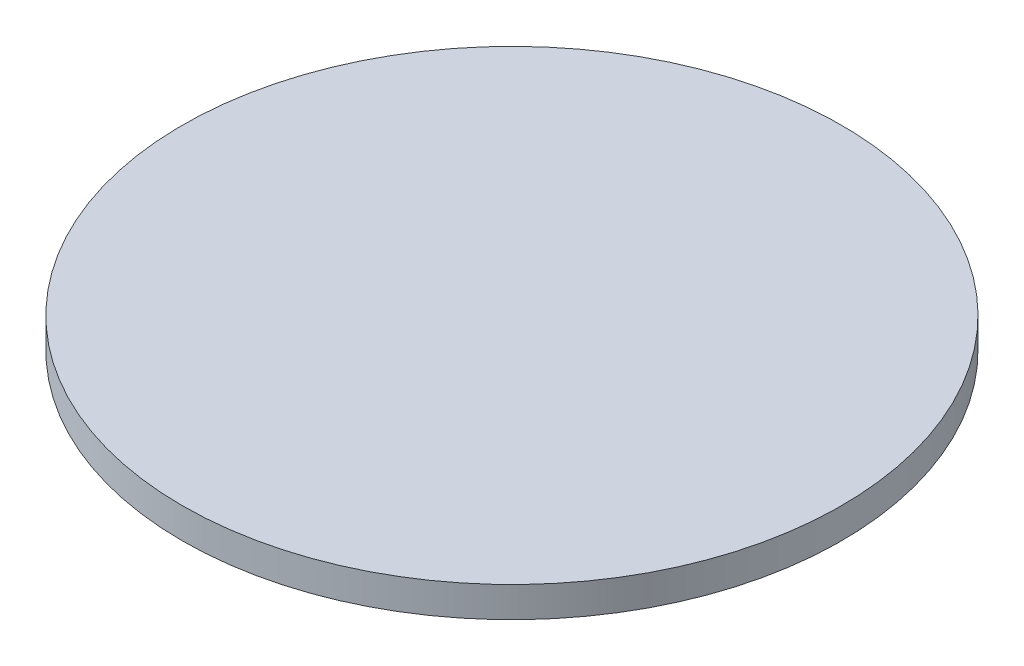
ISO-10303-21;
HEADER;
FILE_DESCRIPTION(('STEP AP214'),'2;1');
FILE_NAME('part.step','',(''),(''),'','','');
FILE_SCHEMA(('AUTOMOTIVE_DESIGN { 1 0 10303 214 1 1 1 1 }'));
ENDSEC;
DATA;
#1=APPLICATION_CONTEXT('core data for automotive mechanical design processes');
#2=APPLICATION_PROTOCOL_DEFINITION('international standard','automotive_design',2000,#1);
#3=PRODUCT_CONTEXT('',#1,'mechanical');
#4=PRODUCT('Part','Part','',(#3));
#5=PRODUCT_RELATED_PRODUCT_CATEGORY('part','',(#4));
#6=PRODUCT_DEFINITION_FORMATION('','',#4);
#7=PRODUCT_DEFINITION_CONTEXT('part definition',#1,'design');
#8=PRODUCT_DEFINITION('design','',#6,#7);
#9=PRODUCT_DEFINITION_SHAPE('','',#8);
#10=(LENGTH_UNIT() NAMED_UNIT(*) SI_UNIT(.MILLI.,.METRE.));
#11=(NAMED_UNIT(*) PLANE_ANGLE_UNIT() SI_UNIT($,.RADIAN.));
#12=(NAMED_UNIT(*) SI_UNIT($,.STERADIAN.) SOLID_ANGLE_UNIT());
#13=UNCERTAINTY_MEASURE_WITH_UNIT(LENGTH_MEASURE(1.E-05),#10,'distance_accuracy_value','');
#14=(GEOMETRIC_REPRESENTATION_CONTEXT(3) GLOBAL_UNCERTAINTY_ASSIGNED_CONTEXT((#13)) GLOBAL_UNIT_ASSIGNED_CONTEXT((#10,
#11,#12)) REPRESENTATION_CONTEXT('',''));
#15=CARTESIAN_POINT('',(0.,0.,0.));
#16=DIRECTION('',(0.,0.,1.));
#17=DIRECTION('',(1.,0.,0.));
#18=AXIS2_PLACEMENT_3D('',#15,#16,#17);
#19=CARTESIAN_POINT('',(0.,0.,0.));
#20=DIRECTION('',(0.,1.,0.));
#21=DIRECTION('',(0.,0.,1.));
#22=AXIS2_PLACEMENT_3D('',#19,#20,#21);
#23=CONICAL_SURFACE('',#22,2.7,0.959931088596883);
#24=CARTESIAN_POINT('',(0.,0.,0.));
#25=DIRECTION('',(0.,1.,0.));
#26=DIRECTION('',(0.,0.,1.));
#27=AXIS2_PLACEMENT_3D('',#24,#25,#26);
#28=CIRCLE('',#27,2.7);
#29=CARTESIAN_POINT('',(0.,0.,2.7));
#30=VERTEX_POINT('',#29);
#31=EDGE_CURVE('E10',#30,#30,#28,.T.);
#32=CARTESIAN_POINT('',(0.,8.61255271997939,0.));
#33=DIRECTION('',(0.,1.,0.));
#34=DIRECTION('',(0.,0.,1.));
#35=AXIS2_PLACEMENT_3D('',#32,#33,#34);
#36=CIRCLE('',#35,15.);
#37=CARTESIAN_POINT('',(0.,8.61255271997939,15.));
#38=VERTEX_POINT('',#37);
#39=EDGE_CURVE('E43',#38,#38,#36,.F.);
#40=CARTESIAN_POINT('',(0.,0.,2.7));
#41=CARTESIAN_POINT('',(0.,0.0897140908331185,2.828125));
#42=CARTESIAN_POINT('',(0.,0.179428181666237,2.95625));
#43=CARTESIAN_POINT('',(0.,0.358856363332474,3.2125));
#44=CARTESIAN_POINT('',(0.,0.448570454165593,3.340625));
#45=CARTESIAN_POINT('',(0.,0.62799863583183,3.596875));
#46=CARTESIAN_POINT('',(0.,0.717712726664949,3.725));
#47=CARTESIAN_POINT('',(0.,0.897140908331186,3.98125));
#48=CARTESIAN_POINT('',(0.,0.986854999164305,4.109375));
#49=CARTESIAN_POINT('',(0.,1.16628318083054,4.365625));
#50=CARTESIAN_POINT('',(0.,1.25599727166366,4.49375));
#51=CARTESIAN_POINT('',(0.,1.4354254533299,4.75));
#52=CARTESIAN_POINT('',(0.,1.52513954416302,4.878125));
#53=CARTESIAN_POINT('',(0.,1.70456772582925,5.134375));
#54=CARTESIAN_POINT('',(0.,1.79428181666237,5.2625));
#55=CARTESIAN_POINT('',(0.,1.97370999832861,5.51875));
#56=CARTESIAN_POINT('',(0.,2.06342408916173,5.646875));
#57=CARTESIAN_POINT('',(0.,2.24285227082797,5.903125));
#58=CARTESIAN_POINT('',(0.,2.33256636166108,6.03125));
#59=CARTESIAN_POINT('',(0.,2.51199454332732,6.2875));
#60=CARTESIAN_POINT('',(0.,2.60170863416044,6.415625));
#61=CARTESIAN_POINT('',(0.,2.78113681582668,6.671875));
#62=CARTESIAN_POINT('',(0.,2.8708509066598,6.8));
#63=CARTESIAN_POINT('',(0.,3.05027908832603,7.05625));
#64=CARTESIAN_POINT('',(0.,3.13999317915915,7.184375));
#65=CARTESIAN_POINT('',(0.,3.31942136082539,7.440625));
#66=CARTESIAN_POINT('',(0.,3.40913545165851,7.56875));
#67=CARTESIAN_POINT('',(0.,3.58856363332474,7.825));
#68=CARTESIAN_POINT('',(0.,3.67827772415786,7.953125));
#69=CARTESIAN_POINT('',(0.,3.8577059058241,8.209375));
#70=CARTESIAN_POINT('',(0.,3.94741999665722,8.3375));
#71=CARTESIAN_POINT('',(0.,4.12684817832346,8.59375));
#72=CARTESIAN_POINT('',(0.,4.21656226915658,8.721875));
#73=CARTESIAN_POINT('',(0.,4.39599045082281,8.978125));
#74=CARTESIAN_POINT('',(0.,4.48570454165593,9.10625));
#75=CARTESIAN_POINT('',(0.,4.66513272332217,9.3625));
#76=CARTESIAN_POINT('',(0.,4.75484681415529,9.490625));
#77=CARTESIAN_POINT('',(0.,4.93427499582152,9.746875));
#78=CARTESIAN_POINT('',(0.,5.02398908665464,9.875));
#79=CARTESIAN_POINT('',(0.,5.20341726832088,10.13125));
#80=CARTESIAN_POINT('',(0.,5.293131359154,10.259375));
#81=CARTESIAN_POINT('',(0.,5.47255954082024,10.515625));
#82=CARTESIAN_POINT('',(0.,5.56227363165335,10.64375));
#83=CARTESIAN_POINT('',(0.,5.74170181331959,10.9));
#84=CARTESIAN_POINT('',(0.,5.83141590415271,11.028125));
#85=CARTESIAN_POINT('',(0.,6.01084408581895,11.284375));
#86=CARTESIAN_POINT('',(0.,6.10055817665207,11.4125));
#87=CARTESIAN_POINT('',(0.,6.2799863583183,11.66875));
#88=CARTESIAN_POINT('',(0.,6.36970044915142,11.796875));
#89=CARTESIAN_POINT('',(0.,6.54912863081766,12.053125));
#90=CARTESIAN_POINT('',(0.,6.63884272165078,12.18125));
#91=CARTESIAN_POINT('',(0.,6.81827090331702,12.4375));
#92=CARTESIAN_POINT('',(0.,6.90798499415013,12.565625));
#93=CARTESIAN_POINT('',(0.,7.08741317581637,12.821875));
#94=CARTESIAN_POINT('',(0.,7.17712726664949,12.95));
#95=CARTESIAN_POINT('',(0.,7.35655544831573,13.20625));
#96=CARTESIAN_POINT('',(0.,7.44626953914885,13.334375));
#97=CARTESIAN_POINT('',(0.,7.62569772081508,13.590625));
#98=CARTESIAN_POINT('',(0.,7.7154118116482,13.71875));
#99=CARTESIAN_POINT('',(0.,7.89483999331444,13.975));
#100=CARTESIAN_POINT('',(0.,7.98455408414756,14.103125));
#101=CARTESIAN_POINT('',(0.,8.16398226581379,14.359375));
#102=CARTESIAN_POINT('',(0.,8.25369635664691,14.4875));
#103=CARTESIAN_POINT('',(0.,8.43312453831315,14.74375));
#104=CARTESIAN_POINT('',(0.,8.52283862914627,14.871875));
#105=CARTESIAN_POINT('',(0.,8.61255271997939,15.));
#106=B_SPLINE_CURVE_WITH_KNOTS('',3,(#40,#41,#42,#43,#44,#45,#46,#47,#48,#49,#50,#51,#52,#53,
#54,#55,#56,#57,#58,#59,#60,#61,#62,#63,#64,#65,#66,#67,#68,#69,#70,#71,#72,#73,#74,#75,#76,#77,
#78,#79,#80,#81,#82,#83,#84,#85,#86,#87,#88,#89,#90,#91,#92,#93,#94,#95,#96,#97,#98,#99,#100,
#101,#102,#103,#104,#105),.UNSPECIFIED.,.F.,.F.,(4,2,2,2,2,2,2,2,2,2,2,2,2,2,2,2,2,2,2,2,2,2,2,
2,2,2,2,2,2,2,2,2,4),(0.,0.469235232555184,0.938470465110367,1.40770569766555,1.87694093022073,
2.34617616277592,2.8154113953311,3.28464662788629,3.75388186044147,4.22311709299665,
4.69235232555184,5.16158755810702,5.63082279066221,6.10005802321739,6.56929325577257,
7.03852848832776,7.50776372088294,7.97699895343812,8.44623418599331,8.91546941854849,
9.38470465110368,9.85393988365886,10.323175116214,10.7924103487692,11.2616455813244,
11.7308808138796,12.2001160464348,12.66935127899,13.1385865115452,13.6078217441003,
14.0770569766555,14.5462922092107,15.0155274417659),.UNSPECIFIED.);
#107=EDGE_CURVE('BSEAM33',#30,#38,#106,.T.);
#108=ORIENTED_EDGE('',*,*,#31,.T.);
#109=ORIENTED_EDGE('',*,*,#39,.T.);
#110=ORIENTED_EDGE('',*,*,#107,.T.);
#111=ORIENTED_EDGE('',*,*,#107,.F.);
#112=EDGE_LOOP('',(#108,#110,#109,#111));
#113=FACE_BOUND('',#112,.T.);
#114=ADVANCED_FACE('F33',(#113),#23,.T.);
#115=CARTESIAN_POINT('',(0.,0.,0.));
#116=DIRECTION('',(0.,1.,0.));
#117=DIRECTION('',(0.,0.,1.));
#118=AXIS2_PLACEMENT_3D('',#115,#116,#117);
#119=PLANE('',#118);
#120=ORIENTED_EDGE('',*,*,#31,.F.);
#121=EDGE_LOOP('',(#120));
#122=FACE_BOUND('',#121,.T.);
#123=ADVANCED_FACE('F54',(#122),#119,.F.);
#124=CARTESIAN_POINT('',(0.,-0.000999999999999265,0.));
#125=DIRECTION('',(0.,1.,0.));
#126=DIRECTION('',(0.,0.,1.));
#127=AXIS2_PLACEMENT_3D('',#124,#125,#126);
#128=CYLINDRICAL_SURFACE('',#127,15.);
#129=CARTESIAN_POINT('',(0.,10.,0.));
#130=DIRECTION('',(0.,1.,0.));
#131=DIRECTION('',(0.,0.,1.));
#132=AXIS2_PLACEMENT_3D('',#129,#130,#131);
#133=CIRCLE('',#132,15.);
#134=CARTESIAN_POINT('',(0.,10.,15.));
#135=VERTEX_POINT('',#134);
#136=EDGE_CURVE('E39',#135,#135,#133,.T.);
#137=ORIENTED_EDGE('',*,*,#136,.F.);
#138=EDGE_LOOP('',(#137));
#139=FACE_BOUND('',#138,.T.);
#140=ORIENTED_EDGE('',*,*,#39,.F.);
#141=EDGE_LOOP('',(#140));
#142=FACE_BOUND('',#141,.T.);
#143=ADVANCED_FACE('F51',(#139,#142),#128,.T.);
#144=CARTESIAN_POINT('',(0.,10.,0.));
#145=DIRECTION('',(0.,1.,0.));
#146=DIRECTION('',(0.,0.,1.));
#147=AXIS2_PLACEMENT_3D('',#144,#145,#146);
#148=PLANE('',#147);
#149=ORIENTED_EDGE('',*,*,#136,.T.);
#150=EDGE_LOOP('',(#149));
#151=FACE_BOUND('',#150,.T.);
#152=ADVANCED_FACE('F53',(#151),#148,.T.);
#153=CLOSED_SHELL('',(#114,#123,#143,#152));
#154=MANIFOLD_SOLID_BREP('B2',#153);
#155=ADVANCED_BREP_SHAPE_REPRESENTATION('',(#18,#154),#14);
#156=SHAPE_DEFINITION_REPRESENTATION(#9,#155);
ENDSEC;
END-ISO-10303-21;
